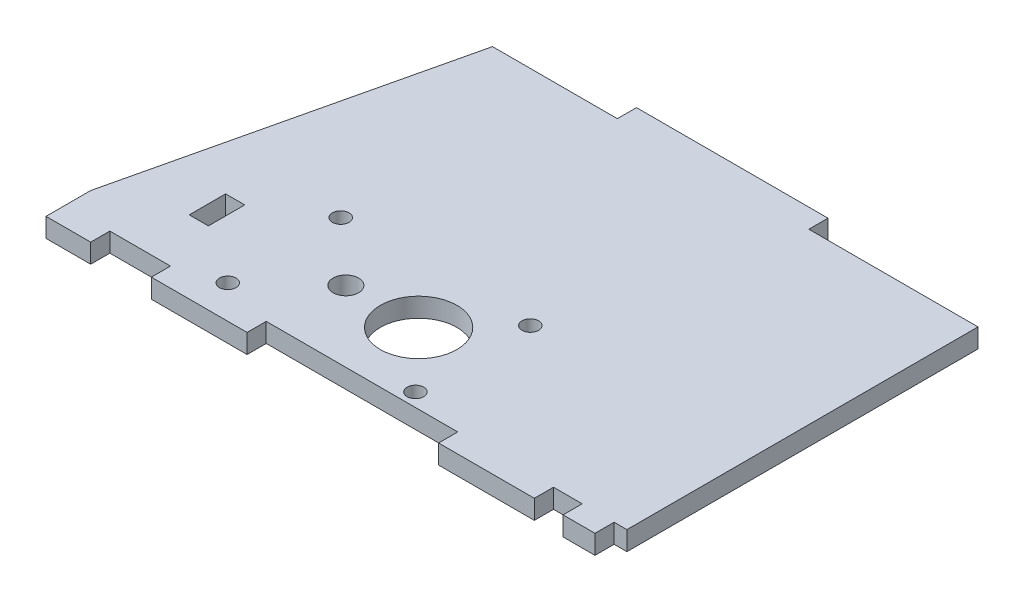
ISO-10303-21;
HEADER;
FILE_DESCRIPTION(('STEP AP214'),'2;1');
FILE_NAME('part.step','',(''),(''),'','','');
FILE_SCHEMA(('AUTOMOTIVE_DESIGN { 1 0 10303 214 1 1 1 1 }'));
ENDSEC;
DATA;
#1=APPLICATION_CONTEXT('core data for automotive mechanical design processes');
#2=APPLICATION_PROTOCOL_DEFINITION('international standard','automotive_design',2000,#1);
#3=PRODUCT_CONTEXT('',#1,'mechanical');
#4=PRODUCT('Part','Part','',(#3));
#5=PRODUCT_RELATED_PRODUCT_CATEGORY('part','',(#4));
#6=PRODUCT_DEFINITION_FORMATION('','',#4);
#7=PRODUCT_DEFINITION_CONTEXT('part definition',#1,'design');
#8=PRODUCT_DEFINITION('design','',#6,#7);
#9=PRODUCT_DEFINITION_SHAPE('','',#8);
#10=(LENGTH_UNIT() NAMED_UNIT(*) SI_UNIT(.MILLI.,.METRE.));
#11=(NAMED_UNIT(*) PLANE_ANGLE_UNIT() SI_UNIT($,.RADIAN.));
#12=(NAMED_UNIT(*) SI_UNIT($,.STERADIAN.) SOLID_ANGLE_UNIT());
#13=UNCERTAINTY_MEASURE_WITH_UNIT(LENGTH_MEASURE(1.E-05),#10,'distance_accuracy_value','');
#14=(GEOMETRIC_REPRESENTATION_CONTEXT(3) GLOBAL_UNCERTAINTY_ASSIGNED_CONTEXT((#13)) GLOBAL_UNIT_ASSIGNED_CONTEXT((#10,
#11,#12)) REPRESENTATION_CONTEXT('',''));
#15=CARTESIAN_POINT('',(0.,0.,0.));
#16=DIRECTION('',(0.,0.,1.));
#17=DIRECTION('',(1.,0.,0.));
#18=AXIS2_PLACEMENT_3D('',#15,#16,#17);
#19=CARTESIAN_POINT('',(0.,3.,0.));
#20=DIRECTION('',(0.,1.,0.));
#21=DIRECTION('',(0.,0.,1.));
#22=AXIS2_PLACEMENT_3D('',#19,#20,#21);
#23=PLANE('',#22);
#24=CARTESIAN_POINT('',(-59.4833722709216,3.,25.0323489280672));
#25=DIRECTION('',(0.,1.,0.));
#26=DIRECTION('',(0.,0.,1.));
#27=AXIS2_PLACEMENT_3D('',#24,#25,#26);
#28=CIRCLE('',#27,1.3);
#29=CARTESIAN_POINT('',(-59.4833722709216,3.,26.3323489280672));
#30=VERTEX_POINT('',#29);
#31=EDGE_CURVE('E275',#30,#30,#28,.T.);
#32=ORIENTED_EDGE('',*,*,#31,.F.);
#33=EDGE_LOOP('',(#32));
#34=FACE_BOUND('',#33,.T.);
#35=CARTESIAN_POINT('',(-67.9833722709216,3.,16.0323489280672));
#36=DIRECTION('',(0.,1.,0.));
#37=DIRECTION('',(0.,0.,1.));
#38=AXIS2_PLACEMENT_3D('',#35,#36,#37);
#39=CIRCLE('',#38,6.);
#40=CARTESIAN_POINT('',(-67.9833722709216,3.,22.0323489280672));
#41=VERTEX_POINT('',#40);
#42=EDGE_CURVE('E291',#41,#41,#39,.T.);
#43=ORIENTED_EDGE('',*,*,#42,.F.);
#44=EDGE_LOOP('',(#43));
#45=FACE_BOUND('',#44,.T.);
#46=CARTESIAN_POINT('',(-59.4833722709216,3.,7.03234892806724));
#47=DIRECTION('',(0.,1.,0.));
#48=DIRECTION('',(0.,0.,1.));
#49=AXIS2_PLACEMENT_3D('',#46,#47,#48);
#50=CIRCLE('',#49,1.3);
#51=CARTESIAN_POINT('',(-59.4833722709216,3.,8.33234892806724));
#52=VERTEX_POINT('',#51);
#53=EDGE_CURVE('E307',#52,#52,#50,.T.);
#54=ORIENTED_EDGE('',*,*,#53,.F.);
#55=EDGE_LOOP('',(#54));
#56=FACE_BOUND('',#55,.T.);
#57=DIRECTION('',(0.,0.,1.));
#58=VECTOR('',#57,1.);
#59=CARTESIAN_POINT('',(-95.7405819948676,3.,27.1466123534186));
#60=LINE('',#59,#58);
#61=CARTESIAN_POINT('',(-95.7405819948676,3.,27.1466123534186));
#62=VERTEX_POINT('',#61);
#63=CARTESIAN_POINT('',(-95.7405819948676,3.,30.1466123534186));
#64=VERTEX_POINT('',#63);
#65=EDGE_CURVE('E315',#62,#64,#60,.T.);
#66=ORIENTED_EDGE('',*,*,#65,.T.);
#67=DIRECTION('',(1.,0.,0.));
#68=VECTOR('',#67,1.);
#69=CARTESIAN_POINT('',(-95.7405819948676,3.,30.1466123534186));
#70=LINE('',#69,#68);
#71=CARTESIAN_POINT('',(-80.7405819948676,3.,30.1466123534186));
#72=VERTEX_POINT('',#71);
#73=EDGE_CURVE('E319',#64,#72,#70,.T.);
#74=ORIENTED_EDGE('',*,*,#73,.T.);
#75=DIRECTION('',(0.,0.,-1.));
#76=VECTOR('',#75,1.);
#77=CARTESIAN_POINT('',(-80.7405819948676,3.,30.1466123534186));
#78=LINE('',#77,#76);
#79=CARTESIAN_POINT('',(-80.7405819948676,3.,27.1466123534186));
#80=VERTEX_POINT('',#79);
#81=EDGE_CURVE('E323',#72,#80,#78,.T.);
#82=ORIENTED_EDGE('',*,*,#81,.T.);
#83=DIRECTION('',(1.,0.,0.));
#84=VECTOR('',#83,1.);
#85=CARTESIAN_POINT('',(-80.7405819948676,3.,27.1466123534186));
#86=LINE('',#85,#84);
#87=CARTESIAN_POINT('',(-50.7405819948676,3.,27.1466123534186));
#88=VERTEX_POINT('',#87);
#89=EDGE_CURVE('E326',#80,#88,#86,.T.);
#90=ORIENTED_EDGE('',*,*,#89,.T.);
#91=DIRECTION('',(0.,0.,1.));
#92=VECTOR('',#91,1.);
#93=CARTESIAN_POINT('',(-50.7405819948676,3.,30.1466123534186));
#94=LINE('',#93,#92);
#95=CARTESIAN_POINT('',(-50.7405819948676,3.,30.1466123534186));
#96=VERTEX_POINT('',#95);
#97=EDGE_CURVE('E329',#88,#96,#94,.T.);
#98=ORIENTED_EDGE('',*,*,#97,.T.);
#99=DIRECTION('',(1.,0.,0.));
#100=VECTOR('',#99,1.);
#101=CARTESIAN_POINT('',(-35.7405819948676,3.,30.1466123534186));
#102=LINE('',#101,#100);
#103=CARTESIAN_POINT('',(-35.7405819948676,3.,30.1466123534186));
#104=VERTEX_POINT('',#103);
#105=EDGE_CURVE('E332',#96,#104,#102,.T.);
#106=ORIENTED_EDGE('',*,*,#105,.T.);
#107=DIRECTION('',(0.,0.,-1.));
#108=VECTOR('',#107,1.);
#109=CARTESIAN_POINT('',(-35.7405819948676,3.,30.1466123534186));
#110=LINE('',#109,#108);
#111=CARTESIAN_POINT('',(-35.7405819948676,3.,27.1466123534186));
#112=VERTEX_POINT('',#111);
#113=EDGE_CURVE('E335',#104,#112,#110,.T.);
#114=ORIENTED_EDGE('',*,*,#113,.T.);
#115=DIRECTION('',(1.,0.,0.));
#116=VECTOR('',#115,1.);
#117=CARTESIAN_POINT('',(-35.7405819948676,3.,27.1466123534186));
#118=LINE('',#117,#116);
#119=CARTESIAN_POINT('',(-31.2405819948676,3.,27.1466123534186));
#120=VERTEX_POINT('',#119);
#121=EDGE_CURVE('E338',#112,#120,#118,.T.);
#122=ORIENTED_EDGE('',*,*,#121,.T.);
#123=DIRECTION('',(0.,0.,1.));
#124=VECTOR('',#123,1.);
#125=CARTESIAN_POINT('',(-31.2405819948676,3.,27.1466123534186));
#126=LINE('',#125,#124);
#127=CARTESIAN_POINT('',(-31.2405819948676,3.,30.1466123534186));
#128=VERTEX_POINT('',#127);
#129=EDGE_CURVE('E341',#120,#128,#126,.T.);
#130=ORIENTED_EDGE('',*,*,#129,.T.);
#131=DIRECTION('',(1.,0.,0.));
#132=VECTOR('',#131,1.);
#133=CARTESIAN_POINT('',(-31.2405819948676,3.,30.1466123534186));
#134=LINE('',#133,#132);
#135=CARTESIAN_POINT('',(-26.2405819948676,3.,30.1466123534186));
#136=VERTEX_POINT('',#135);
#137=EDGE_CURVE('E344',#128,#136,#134,.T.);
#138=ORIENTED_EDGE('',*,*,#137,.T.);
#139=DIRECTION('',(0.,0.,-1.));
#140=VECTOR('',#139,1.);
#141=CARTESIAN_POINT('',(-26.2405819948676,3.,30.1466123534186));
#142=LINE('',#141,#140);
#143=CARTESIAN_POINT('',(-26.2405819948676,3.,27.1466123534186));
#144=VERTEX_POINT('',#143);
#145=EDGE_CURVE('E347',#136,#144,#142,.T.);
#146=ORIENTED_EDGE('',*,*,#145,.T.);
#147=DIRECTION('',(1.,0.,0.));
#148=VECTOR('',#147,1.);
#149=CARTESIAN_POINT('',(-26.2405819948676,3.,27.1466123534186));
#150=LINE('',#149,#148);
#151=CARTESIAN_POINT('',(-24.2405819948676,3.,27.1466123534186));
#152=VERTEX_POINT('',#151);
#153=EDGE_CURVE('E350',#144,#152,#150,.T.);
#154=ORIENTED_EDGE('',*,*,#153,.T.);
#155=DIRECTION('',(0.,0.,-1.));
#156=VECTOR('',#155,1.);
#157=CARTESIAN_POINT('',(-24.2405819948676,3.,27.1466123534186));
#158=LINE('',#157,#156);
#159=CARTESIAN_POINT('',(-24.2405819948676,3.,-27.8533876465814));
#160=VERTEX_POINT('',#159);
#161=EDGE_CURVE('E353',#152,#160,#158,.T.);
#162=ORIENTED_EDGE('',*,*,#161,.T.);
#163=DIRECTION('',(-1.,0.,0.));
#164=VECTOR('',#163,1.);
#165=CARTESIAN_POINT('',(-24.2405819948676,3.,-27.8533876465814));
#166=LINE('',#165,#164);
#167=CARTESIAN_POINT('',(-50.7405819948676,3.,-27.8533876465814));
#168=VERTEX_POINT('',#167);
#169=EDGE_CURVE('E356',#160,#168,#166,.T.);
#170=ORIENTED_EDGE('',*,*,#169,.T.);
#171=DIRECTION('',(0.,0.,-1.));
#172=VECTOR('',#171,1.);
#173=CARTESIAN_POINT('',(-50.7405819948676,3.,-27.8533876465814));
#174=LINE('',#173,#172);
#175=CARTESIAN_POINT('',(-50.7405819948676,3.,-30.8533876465814));
#176=VERTEX_POINT('',#175);
#177=EDGE_CURVE('E359',#168,#176,#174,.T.);
#178=ORIENTED_EDGE('',*,*,#177,.T.);
#179=DIRECTION('',(-1.,0.,0.));
#180=VECTOR('',#179,1.);
#181=CARTESIAN_POINT('',(-80.7405819948676,3.,-30.8533876465814));
#182=LINE('',#181,#180);
#183=CARTESIAN_POINT('',(-80.7405819948676,3.,-30.8533876465814));
#184=VERTEX_POINT('',#183);
#185=EDGE_CURVE('E362',#176,#184,#182,.T.);
#186=ORIENTED_EDGE('',*,*,#185,.T.);
#187=DIRECTION('',(0.,0.,1.));
#188=VECTOR('',#187,1.);
#189=CARTESIAN_POINT('',(-80.7405819948676,3.,-27.8533876465814));
#190=LINE('',#189,#188);
#191=CARTESIAN_POINT('',(-80.7405819948676,3.,-27.8533876465814));
#192=VERTEX_POINT('',#191);
#193=EDGE_CURVE('E365',#184,#192,#190,.T.);
#194=ORIENTED_EDGE('',*,*,#193,.T.);
#195=DIRECTION('',(-1.,0.,0.));
#196=VECTOR('',#195,1.);
#197=CARTESIAN_POINT('',(-95.7405819948676,3.,-27.8533876465814));
#198=LINE('',#197,#196);
#199=CARTESIAN_POINT('',(-100.290581994868,3.,-27.8533876465814));
#200=VERTEX_POINT('',#199);
#201=EDGE_CURVE('E368',#192,#200,#198,.T.);
#202=ORIENTED_EDGE('',*,*,#201,.T.);
#203=DIRECTION('',(-0.228134770233683,0.,0.973629563340404));
#204=VECTOR('',#203,1.);
#205=CARTESIAN_POINT('',(-100.290581994868,3.,-27.8533876465814));
#206=LINE('',#205,#204);
#207=CARTESIAN_POINT('',(-112.240581994868,3.,23.1466123534186));
#208=VERTEX_POINT('',#207);
#209=EDGE_CURVE('E371',#200,#208,#206,.T.);
#210=ORIENTED_EDGE('',*,*,#209,.T.);
#211=DIRECTION('',(0.,0.,1.));
#212=VECTOR('',#211,1.);
#213=CARTESIAN_POINT('',(-112.240581994868,3.,27.1466123534186));
#214=LINE('',#213,#212);
#215=CARTESIAN_POINT('',(-112.240581994868,3.,30.1466123534186));
#216=VERTEX_POINT('',#215);
#217=EDGE_CURVE('E374',#208,#216,#214,.T.);
#218=ORIENTED_EDGE('',*,*,#217,.T.);
#219=DIRECTION('',(1.,0.,0.));
#220=VECTOR('',#219,1.);
#221=CARTESIAN_POINT('',(-112.240581994868,3.,30.1466123534186));
#222=LINE('',#221,#220);
#223=CARTESIAN_POINT('',(-105.240581994868,3.,30.1466123534186));
#224=VERTEX_POINT('',#223);
#225=EDGE_CURVE('E377',#216,#224,#222,.T.);
#226=ORIENTED_EDGE('',*,*,#225,.T.);
#227=DIRECTION('',(0.,0.,-1.));
#228=VECTOR('',#227,1.);
#229=CARTESIAN_POINT('',(-105.240581994868,3.,30.1466123534186));
#230=LINE('',#229,#228);
#231=CARTESIAN_POINT('',(-105.240581994868,3.,27.1466123534186));
#232=VERTEX_POINT('',#231);
#233=EDGE_CURVE('E380',#224,#232,#230,.T.);
#234=ORIENTED_EDGE('',*,*,#233,.T.);
#235=DIRECTION('',(1.,0.,0.));
#236=VECTOR('',#235,1.);
#237=CARTESIAN_POINT('',(-105.240581994868,3.,27.1466123534186));
#238=LINE('',#237,#236);
#239=EDGE_CURVE('E383',#232,#62,#238,.T.);
#240=ORIENTED_EDGE('',*,*,#239,.T.);
#241=EDGE_LOOP('',(#66,#74,#82,#90,#98,#106,#114,#122,#130,#138,#146,#154,#162,#170,#178,#186,
#194,#202,#210,#218,#226,#234,#240));
#242=FACE_BOUND('',#241,.T.);
#243=CARTESIAN_POINT('',(-79.3833722709216,3.,16.0323489280672));
#244=DIRECTION('',(0.,1.,0.));
#245=DIRECTION('',(0.,0.,1.));
#246=AXIS2_PLACEMENT_3D('',#243,#244,#245);
#247=CIRCLE('',#246,2.);
#248=CARTESIAN_POINT('',(-79.3833722709216,3.,18.0323489280672));
#249=VERTEX_POINT('',#248);
#250=EDGE_CURVE('E299',#249,#249,#247,.T.);
#251=ORIENTED_EDGE('',*,*,#250,.F.);
#252=EDGE_LOOP('',(#251));
#253=FACE_BOUND('',#252,.T.);
#254=CARTESIAN_POINT('',(-88.98337227,3.,7.23234893));
#255=DIRECTION('',(0.,1.,0.));
#256=DIRECTION('',(0.,0.,1.));
#257=AXIS2_PLACEMENT_3D('',#254,#255,#256);
#258=CIRCLE('',#257,1.29999999999999);
#259=CARTESIAN_POINT('',(-88.98337227,3.,8.53234892999999));
#260=VERTEX_POINT('',#259);
#261=EDGE_CURVE('E283',#260,#260,#258,.T.);
#262=ORIENTED_EDGE('',*,*,#261,.F.);
#263=EDGE_LOOP('',(#262));
#264=FACE_BOUND('',#263,.T.);
#265=CARTESIAN_POINT('',(-88.98337227,3.,24.93234893));
#266=DIRECTION('',(0.,1.,0.));
#267=DIRECTION('',(0.,0.,1.));
#268=AXIS2_PLACEMENT_3D('',#265,#266,#267);
#269=CIRCLE('',#268,1.3);
#270=CARTESIAN_POINT('',(-88.98337227,3.,26.23234893));
#271=VERTEX_POINT('',#270);
#272=EDGE_CURVE('E267',#271,#271,#269,.T.);
#273=ORIENTED_EDGE('',*,*,#272,.F.);
#274=EDGE_LOOP('',(#273));
#275=FACE_BOUND('',#274,.T.);
#276=DIRECTION('',(1.,0.,0.));
#277=VECTOR('',#276,1.);
#278=CARTESIAN_POINT('',(-98.2202350873633,3.,18.7291448471575));
#279=LINE('',#278,#277);
#280=CARTESIAN_POINT('',(-101.220235087363,3.,18.7291448471575));
#281=VERTEX_POINT('',#280);
#282=CARTESIAN_POINT('',(-98.2202350873633,3.,18.7291448471575));
#283=VERTEX_POINT('',#282);
#284=EDGE_CURVE('E228',#281,#283,#279,.T.);
#285=ORIENTED_EDGE('',*,*,#284,.F.);
#286=DIRECTION('',(0.,0.,1.));
#287=VECTOR('',#286,1.);
#288=CARTESIAN_POINT('',(-101.220235087363,3.,18.7291448471575));
#289=LINE('',#288,#287);
#290=CARTESIAN_POINT('',(-101.220235087363,3.,13.0323489280672));
#291=VERTEX_POINT('',#290);
#292=EDGE_CURVE('E219',#291,#281,#289,.T.);
#293=ORIENTED_EDGE('',*,*,#292,.F.);
#294=DIRECTION('',(-1.,0.,0.));
#295=VECTOR('',#294,1.);
#296=CARTESIAN_POINT('',(-101.220235087363,3.,13.0323489280672));
#297=LINE('',#296,#295);
#298=CARTESIAN_POINT('',(-98.2202350873633,3.,13.0323489280672));
#299=VERTEX_POINT('',#298);
#300=EDGE_CURVE('E245',#299,#291,#297,.T.);
#301=ORIENTED_EDGE('',*,*,#300,.F.);
#302=DIRECTION('',(0.,0.,-1.));
#303=VECTOR('',#302,1.);
#304=CARTESIAN_POINT('',(-98.2202350873633,3.,13.0323489280672));
#305=LINE('',#304,#303);
#306=EDGE_CURVE('E241',#283,#299,#305,.T.);
#307=ORIENTED_EDGE('',*,*,#306,.F.);
#308=EDGE_LOOP('',(#285,#293,#301,#307));
#309=FACE_BOUND('',#308,.T.);
#310=ADVANCED_FACE('F39',(#34,#45,#56,#242,#253,#264,#275,#309),#23,.T.);
#311=CARTESIAN_POINT('',(0.,0.,0.));
#312=DIRECTION('',(0.,1.,0.));
#313=DIRECTION('',(0.,0.,1.));
#314=AXIS2_PLACEMENT_3D('',#311,#312,#313);
#315=PLANE('',#314);
#316=CARTESIAN_POINT('',(-88.98337227,0.,24.93234893));
#317=DIRECTION('',(0.,1.,0.));
#318=DIRECTION('',(0.,0.,1.));
#319=AXIS2_PLACEMENT_3D('',#316,#317,#318);
#320=CIRCLE('',#319,1.3);
#321=CARTESIAN_POINT('',(-88.98337227,0.,26.23234893));
#322=VERTEX_POINT('',#321);
#323=EDGE_CURVE('E237',#322,#322,#320,.T.);
#324=ORIENTED_EDGE('',*,*,#323,.T.);
#325=EDGE_LOOP('',(#324));
#326=FACE_BOUND('',#325,.T.);
#327=CARTESIAN_POINT('',(-59.4833722709216,0.,25.0323489280672));
#328=DIRECTION('',(0.,1.,0.));
#329=DIRECTION('',(0.,0.,1.));
#330=AXIS2_PLACEMENT_3D('',#327,#328,#329);
#331=CIRCLE('',#330,1.3);
#332=CARTESIAN_POINT('',(-59.4833722709216,0.,26.3323489280672));
#333=VERTEX_POINT('',#332);
#334=EDGE_CURVE('E271',#333,#333,#331,.T.);
#335=ORIENTED_EDGE('',*,*,#334,.T.);
#336=EDGE_LOOP('',(#335));
#337=FACE_BOUND('',#336,.T.);
#338=CARTESIAN_POINT('',(-88.98337227,0.,7.23234893));
#339=DIRECTION('',(0.,1.,0.));
#340=DIRECTION('',(0.,0.,1.));
#341=AXIS2_PLACEMENT_3D('',#338,#339,#340);
#342=CIRCLE('',#341,1.29999999999999);
#343=CARTESIAN_POINT('',(-88.98337227,0.,8.53234892999999));
#344=VERTEX_POINT('',#343);
#345=EDGE_CURVE('E279',#344,#344,#342,.T.);
#346=ORIENTED_EDGE('',*,*,#345,.T.);
#347=EDGE_LOOP('',(#346));
#348=FACE_BOUND('',#347,.T.);
#349=CARTESIAN_POINT('',(-67.9833722709216,0.,16.0323489280672));
#350=DIRECTION('',(0.,1.,0.));
#351=DIRECTION('',(0.,0.,1.));
#352=AXIS2_PLACEMENT_3D('',#349,#350,#351);
#353=CIRCLE('',#352,6.);
#354=CARTESIAN_POINT('',(-67.9833722709216,0.,22.0323489280672));
#355=VERTEX_POINT('',#354);
#356=EDGE_CURVE('E287',#355,#355,#353,.T.);
#357=ORIENTED_EDGE('',*,*,#356,.T.);
#358=EDGE_LOOP('',(#357));
#359=FACE_BOUND('',#358,.T.);
#360=CARTESIAN_POINT('',(-79.3833722709216,0.,16.0323489280672));
#361=DIRECTION('',(0.,1.,0.));
#362=DIRECTION('',(0.,0.,1.));
#363=AXIS2_PLACEMENT_3D('',#360,#361,#362);
#364=CIRCLE('',#363,2.);
#365=CARTESIAN_POINT('',(-79.3833722709216,0.,18.0323489280672));
#366=VERTEX_POINT('',#365);
#367=EDGE_CURVE('E295',#366,#366,#364,.T.);
#368=ORIENTED_EDGE('',*,*,#367,.T.);
#369=EDGE_LOOP('',(#368));
#370=FACE_BOUND('',#369,.T.);
#371=CARTESIAN_POINT('',(-59.4833722709216,0.,7.03234892806724));
#372=DIRECTION('',(0.,1.,0.));
#373=DIRECTION('',(0.,0.,1.));
#374=AXIS2_PLACEMENT_3D('',#371,#372,#373);
#375=CIRCLE('',#374,1.3);
#376=CARTESIAN_POINT('',(-59.4833722709216,0.,8.33234892806724));
#377=VERTEX_POINT('',#376);
#378=EDGE_CURVE('E303',#377,#377,#375,.T.);
#379=ORIENTED_EDGE('',*,*,#378,.T.);
#380=EDGE_LOOP('',(#379));
#381=FACE_BOUND('',#380,.T.);
#382=DIRECTION('',(0.,0.,1.));
#383=VECTOR('',#382,1.);
#384=CARTESIAN_POINT('',(-95.7405819948676,0.,27.1466123534186));
#385=LINE('',#384,#383);
#386=CARTESIAN_POINT('',(-95.7405819948676,0.,27.1466123534186));
#387=VERTEX_POINT('',#386);
#388=CARTESIAN_POINT('',(-95.7405819948676,0.,30.1466123534186));
#389=VERTEX_POINT('',#388);
#390=EDGE_CURVE('E311',#387,#389,#385,.T.);
#391=ORIENTED_EDGE('',*,*,#390,.F.);
#392=DIRECTION('',(1.,0.,0.));
#393=VECTOR('',#392,1.);
#394=CARTESIAN_POINT('',(-105.240581994868,0.,27.1466123534186));
#395=LINE('',#394,#393);
#396=CARTESIAN_POINT('',(-105.240581994868,0.,27.1466123534186));
#397=VERTEX_POINT('',#396);
#398=EDGE_CURVE('E320',#397,#387,#395,.T.);
#399=ORIENTED_EDGE('',*,*,#398,.F.);
#400=DIRECTION('',(0.,0.,-1.));
#401=VECTOR('',#400,1.);
#402=CARTESIAN_POINT('',(-105.240581994868,0.,30.1466123534186));
#403=LINE('',#402,#401);
#404=CARTESIAN_POINT('',(-105.240581994868,0.,30.1466123534186));
#405=VERTEX_POINT('',#404);
#406=EDGE_CURVE('E453',#405,#397,#403,.T.);
#407=ORIENTED_EDGE('',*,*,#406,.F.);
#408=DIRECTION('',(1.,0.,0.));
#409=VECTOR('',#408,1.);
#410=CARTESIAN_POINT('',(-112.240581994868,0.,30.1466123534186));
#411=LINE('',#410,#409);
#412=CARTESIAN_POINT('',(-112.240581994868,0.,30.1466123534186));
#413=VERTEX_POINT('',#412);
#414=EDGE_CURVE('E450',#413,#405,#411,.T.);
#415=ORIENTED_EDGE('',*,*,#414,.F.);
#416=DIRECTION('',(0.,0.,1.));
#417=VECTOR('',#416,1.);
#418=CARTESIAN_POINT('',(-112.240581994868,0.,27.1466123534186));
#419=LINE('',#418,#417);
#420=CARTESIAN_POINT('',(-112.240581994868,0.,23.1466123534186));
#421=VERTEX_POINT('',#420);
#422=EDGE_CURVE('E447',#421,#413,#419,.T.);
#423=ORIENTED_EDGE('',*,*,#422,.F.);
#424=DIRECTION('',(-0.228134770233683,0.,0.973629563340404));
#425=VECTOR('',#424,1.);
#426=CARTESIAN_POINT('',(-100.290581994868,0.,-27.8533876465814));
#427=LINE('',#426,#425);
#428=CARTESIAN_POINT('',(-100.290581994868,0.,-27.8533876465814));
#429=VERTEX_POINT('',#428);
#430=EDGE_CURVE('E443',#429,#421,#427,.T.);
#431=ORIENTED_EDGE('',*,*,#430,.F.);
#432=DIRECTION('',(-1.,0.,0.));
#433=VECTOR('',#432,1.);
#434=CARTESIAN_POINT('',(-95.7405819948676,0.,-27.8533876465814));
#435=LINE('',#434,#433);
#436=CARTESIAN_POINT('',(-80.7405819948676,0.,-27.8533876465814));
#437=VERTEX_POINT('',#436);
#438=EDGE_CURVE('E440',#437,#429,#435,.T.);
#439=ORIENTED_EDGE('',*,*,#438,.F.);
#440=DIRECTION('',(0.,0.,1.));
#441=VECTOR('',#440,1.);
#442=CARTESIAN_POINT('',(-80.7405819948676,0.,-27.8533876465814));
#443=LINE('',#442,#441);
#444=CARTESIAN_POINT('',(-80.7405819948676,0.,-30.8533876465814));
#445=VERTEX_POINT('',#444);
#446=EDGE_CURVE('E436',#445,#437,#443,.T.);
#447=ORIENTED_EDGE('',*,*,#446,.F.);
#448=DIRECTION('',(-1.,0.,0.));
#449=VECTOR('',#448,1.);
#450=CARTESIAN_POINT('',(-80.7405819948676,0.,-30.8533876465814));
#451=LINE('',#450,#449);
#452=CARTESIAN_POINT('',(-50.7405819948676,0.,-30.8533876465814));
#453=VERTEX_POINT('',#452);
#454=EDGE_CURVE('E433',#453,#445,#451,.T.);
#455=ORIENTED_EDGE('',*,*,#454,.F.);
#456=DIRECTION('',(0.,0.,-1.));
#457=VECTOR('',#456,1.);
#458=CARTESIAN_POINT('',(-50.7405819948676,0.,-27.8533876465814));
#459=LINE('',#458,#457);
#460=CARTESIAN_POINT('',(-50.7405819948676,0.,-27.8533876465814));
#461=VERTEX_POINT('',#460);
#462=EDGE_CURVE('E430',#461,#453,#459,.T.);
#463=ORIENTED_EDGE('',*,*,#462,.F.);
#464=DIRECTION('',(-1.,0.,0.));
#465=VECTOR('',#464,1.);
#466=CARTESIAN_POINT('',(-35.7405819948676,0.,-27.8533876465814));
#467=LINE('',#466,#465);
#468=CARTESIAN_POINT('',(-24.2405819948676,0.,-27.8533876465814));
#469=VERTEX_POINT('',#468);
#470=EDGE_CURVE('E427',#469,#461,#467,.T.);
#471=ORIENTED_EDGE('',*,*,#470,.F.);
#472=DIRECTION('',(0.,0.,-1.));
#473=VECTOR('',#472,1.);
#474=CARTESIAN_POINT('',(-24.2405819948676,0.,27.1466123534186));
#475=LINE('',#474,#473);
#476=CARTESIAN_POINT('',(-24.2405819948676,0.,27.1466123534186));
#477=VERTEX_POINT('',#476);
#478=EDGE_CURVE('E423',#477,#469,#475,.T.);
#479=ORIENTED_EDGE('',*,*,#478,.F.);
#480=DIRECTION('',(1.,0.,0.));
#481=VECTOR('',#480,1.);
#482=CARTESIAN_POINT('',(-26.2405819948676,0.,27.1466123534186));
#483=LINE('',#482,#481);
#484=CARTESIAN_POINT('',(-26.2405819948676,0.,27.1466123534186));
#485=VERTEX_POINT('',#484);
#486=EDGE_CURVE('E420',#485,#477,#483,.T.);
#487=ORIENTED_EDGE('',*,*,#486,.F.);
#488=DIRECTION('',(0.,0.,-1.));
#489=VECTOR('',#488,1.);
#490=CARTESIAN_POINT('',(-26.2405819948676,0.,30.1466123534186));
#491=LINE('',#490,#489);
#492=CARTESIAN_POINT('',(-26.2405819948676,0.,30.1466123534186));
#493=VERTEX_POINT('',#492);
#494=EDGE_CURVE('E417',#493,#485,#491,.T.);
#495=ORIENTED_EDGE('',*,*,#494,.F.);
#496=DIRECTION('',(1.,0.,0.));
#497=VECTOR('',#496,1.);
#498=CARTESIAN_POINT('',(-31.2405819948676,0.,30.1466123534186));
#499=LINE('',#498,#497);
#500=CARTESIAN_POINT('',(-31.2405819948676,0.,30.1466123534186));
#501=VERTEX_POINT('',#500);
#502=EDGE_CURVE('E414',#501,#493,#499,.T.);
#503=ORIENTED_EDGE('',*,*,#502,.F.);
#504=DIRECTION('',(0.,0.,1.));
#505=VECTOR('',#504,1.);
#506=CARTESIAN_POINT('',(-31.2405819948676,0.,27.1466123534186));
#507=LINE('',#506,#505);
#508=CARTESIAN_POINT('',(-31.2405819948676,0.,27.1466123534186));
#509=VERTEX_POINT('',#508);
#510=EDGE_CURVE('E411',#509,#501,#507,.T.);
#511=ORIENTED_EDGE('',*,*,#510,.F.);
#512=DIRECTION('',(1.,0.,0.));
#513=VECTOR('',#512,1.);
#514=CARTESIAN_POINT('',(-35.7405819948676,0.,27.1466123534186));
#515=LINE('',#514,#513);
#516=CARTESIAN_POINT('',(-35.7405819948676,0.,27.1466123534186));
#517=VERTEX_POINT('',#516);
#518=EDGE_CURVE('E408',#517,#509,#515,.T.);
#519=ORIENTED_EDGE('',*,*,#518,.F.);
#520=DIRECTION('',(0.,0.,-1.));
#521=VECTOR('',#520,1.);
#522=CARTESIAN_POINT('',(-35.7405819948676,0.,30.1466123534186));
#523=LINE('',#522,#521);
#524=CARTESIAN_POINT('',(-35.7405819948676,0.,30.1466123534186));
#525=VERTEX_POINT('',#524);
#526=EDGE_CURVE('E405',#525,#517,#523,.T.);
#527=ORIENTED_EDGE('',*,*,#526,.F.);
#528=DIRECTION('',(1.,0.,0.));
#529=VECTOR('',#528,1.);
#530=CARTESIAN_POINT('',(-35.7405819948676,0.,30.1466123534186));
#531=LINE('',#530,#529);
#532=CARTESIAN_POINT('',(-50.7405819948676,0.,30.1466123534186));
#533=VERTEX_POINT('',#532);
#534=EDGE_CURVE('E402',#533,#525,#531,.T.);
#535=ORIENTED_EDGE('',*,*,#534,.F.);
#536=DIRECTION('',(0.,0.,1.));
#537=VECTOR('',#536,1.);
#538=CARTESIAN_POINT('',(-50.7405819948676,0.,30.1466123534186));
#539=LINE('',#538,#537);
#540=CARTESIAN_POINT('',(-50.7405819948676,0.,27.1466123534186));
#541=VERTEX_POINT('',#540);
#542=EDGE_CURVE('E399',#541,#533,#539,.T.);
#543=ORIENTED_EDGE('',*,*,#542,.F.);
#544=DIRECTION('',(1.,0.,0.));
#545=VECTOR('',#544,1.);
#546=CARTESIAN_POINT('',(-80.7405819948676,0.,27.1466123534186));
#547=LINE('',#546,#545);
#548=CARTESIAN_POINT('',(-80.7405819948676,0.,27.1466123534186));
#549=VERTEX_POINT('',#548);
#550=EDGE_CURVE('E396',#549,#541,#547,.T.);
#551=ORIENTED_EDGE('',*,*,#550,.F.);
#552=DIRECTION('',(0.,0.,-1.));
#553=VECTOR('',#552,1.);
#554=CARTESIAN_POINT('',(-80.7405819948676,0.,30.1466123534186));
#555=LINE('',#554,#553);
#556=CARTESIAN_POINT('',(-80.7405819948676,0.,30.1466123534186));
#557=VERTEX_POINT('',#556);
#558=EDGE_CURVE('E393',#557,#549,#555,.T.);
#559=ORIENTED_EDGE('',*,*,#558,.F.);
#560=DIRECTION('',(1.,0.,0.));
#561=VECTOR('',#560,1.);
#562=CARTESIAN_POINT('',(-95.7405819948676,0.,30.1466123534186));
#563=LINE('',#562,#561);
#564=EDGE_CURVE('E390',#389,#557,#563,.T.);
#565=ORIENTED_EDGE('',*,*,#564,.F.);
#566=EDGE_LOOP('',(#391,#399,#407,#415,#423,#431,#439,#447,#455,#463,#471,#479,#487,#495,#503,
#511,#519,#527,#535,#543,#551,#559,#565));
#567=FACE_BOUND('',#566,.T.);
#568=DIRECTION('',(0.,0.,1.));
#569=VECTOR('',#568,1.);
#570=CARTESIAN_POINT('',(-101.220235087363,0.,18.7291448471575));
#571=LINE('',#570,#569);
#572=CARTESIAN_POINT('',(-101.220235087363,0.,13.0323489280672));
#573=VERTEX_POINT('',#572);
#574=CARTESIAN_POINT('',(-101.220235087363,0.,18.7291448471575));
#575=VERTEX_POINT('',#574);
#576=EDGE_CURVE('E63',#573,#575,#571,.T.);
#577=ORIENTED_EDGE('',*,*,#576,.T.);
#578=DIRECTION('',(1.,0.,0.));
#579=VECTOR('',#578,1.);
#580=CARTESIAN_POINT('',(-98.2202350873633,0.,18.7291448471575));
#581=LINE('',#580,#579);
#582=CARTESIAN_POINT('',(-98.2202350873633,0.,18.7291448471575));
#583=VERTEX_POINT('',#582);
#584=EDGE_CURVE('E235',#575,#583,#581,.T.);
#585=ORIENTED_EDGE('',*,*,#584,.T.);
#586=DIRECTION('',(0.,0.,-1.));
#587=VECTOR('',#586,1.);
#588=CARTESIAN_POINT('',(-98.2202350873633,0.,13.0323489280672));
#589=LINE('',#588,#587);
#590=CARTESIAN_POINT('',(-98.2202350873633,0.,13.0323489280672));
#591=VERTEX_POINT('',#590);
#592=EDGE_CURVE('E254',#583,#591,#589,.T.);
#593=ORIENTED_EDGE('',*,*,#592,.T.);
#594=DIRECTION('',(-1.,0.,0.));
#595=VECTOR('',#594,1.);
#596=CARTESIAN_POINT('',(-101.220235087363,0.,13.0323489280672));
#597=LINE('',#596,#595);
#598=EDGE_CURVE('E229',#591,#573,#597,.T.);
#599=ORIENTED_EDGE('',*,*,#598,.T.);
#600=EDGE_LOOP('',(#577,#585,#593,#599));
#601=FACE_BOUND('',#600,.T.);
#602=ADVANCED_FACE('F552',(#326,#337,#348,#359,#370,#381,#567,#601),#315,.F.);
#603=CARTESIAN_POINT('',(-95.7405819948676,3.,27.1466123534186));
#604=DIRECTION('',(1.,0.,0.));
#605=DIRECTION('',(0.,0.,-1.));
#606=AXIS2_PLACEMENT_3D('',#603,#604,#605);
#607=PLANE('',#606);
#608=ORIENTED_EDGE('',*,*,#390,.T.);
#609=DIRECTION('',(0.,-1.,0.));
#610=VECTOR('',#609,1.);
#611=CARTESIAN_POINT('',(-95.7405819948676,3.,30.1466123534186));
#612=LINE('',#611,#610);
#613=EDGE_CURVE('E11',#64,#389,#612,.T.);
#614=ORIENTED_EDGE('',*,*,#613,.F.);
#615=ORIENTED_EDGE('',*,*,#65,.F.);
#616=DIRECTION('',(0.,-1.,0.));
#617=VECTOR('',#616,1.);
#618=CARTESIAN_POINT('',(-95.7405819948676,3.,27.1466123534186));
#619=LINE('',#618,#617);
#620=EDGE_CURVE('E386',#62,#387,#619,.T.);
#621=ORIENTED_EDGE('',*,*,#620,.T.);
#622=EDGE_LOOP('',(#608,#614,#615,#621));
#623=FACE_BOUND('',#622,.T.);
#624=ADVANCED_FACE('F41',(#623),#607,.F.);
#625=CARTESIAN_POINT('',(-95.7405819948676,3.,30.1466123534186));
#626=DIRECTION('',(0.,0.,-1.));
#627=DIRECTION('',(-1.,0.,0.));
#628=AXIS2_PLACEMENT_3D('',#625,#626,#627);
#629=PLANE('',#628);
#630=ORIENTED_EDGE('',*,*,#564,.T.);
#631=DIRECTION('',(0.,-1.,0.));
#632=VECTOR('',#631,1.);
#633=CARTESIAN_POINT('',(-80.7405819948676,3.,30.1466123534186));
#634=LINE('',#633,#632);
#635=EDGE_CURVE('E48',#72,#557,#634,.T.);
#636=ORIENTED_EDGE('',*,*,#635,.F.);
#637=ORIENTED_EDGE('',*,*,#73,.F.);
#638=ORIENTED_EDGE('',*,*,#613,.T.);
#639=EDGE_LOOP('',(#630,#636,#637,#638));
#640=FACE_BOUND('',#639,.T.);
#641=ADVANCED_FACE('F570',(#640),#629,.F.);
#642=CARTESIAN_POINT('',(-80.7405819948676,3.,30.1466123534186));
#643=DIRECTION('',(-1.,0.,0.));
#644=DIRECTION('',(0.,0.,1.));
#645=AXIS2_PLACEMENT_3D('',#642,#643,#644);
#646=PLANE('',#645);
#647=ORIENTED_EDGE('',*,*,#558,.T.);
#648=DIRECTION('',(0.,-1.,0.));
#649=VECTOR('',#648,1.);
#650=CARTESIAN_POINT('',(-80.7405819948676,3.,27.1466123534186));
#651=LINE('',#650,#649);
#652=EDGE_CURVE('E537',#80,#549,#651,.T.);
#653=ORIENTED_EDGE('',*,*,#652,.F.);
#654=ORIENTED_EDGE('',*,*,#81,.F.);
#655=ORIENTED_EDGE('',*,*,#635,.T.);
#656=EDGE_LOOP('',(#647,#653,#654,#655));
#657=FACE_BOUND('',#656,.T.);
#658=ADVANCED_FACE('F546',(#657),#646,.F.);
#659=CARTESIAN_POINT('',(-80.7405819948676,3.,27.1466123534186));
#660=DIRECTION('',(0.,0.,-1.));
#661=DIRECTION('',(-1.,0.,0.));
#662=AXIS2_PLACEMENT_3D('',#659,#660,#661);
#663=PLANE('',#662);
#664=ORIENTED_EDGE('',*,*,#550,.T.);
#665=DIRECTION('',(0.,-1.,0.));
#666=VECTOR('',#665,1.);
#667=CARTESIAN_POINT('',(-50.7405819948676,3.,27.1466123534186));
#668=LINE('',#667,#666);
#669=EDGE_CURVE('E533',#88,#541,#668,.T.);
#670=ORIENTED_EDGE('',*,*,#669,.F.);
#671=ORIENTED_EDGE('',*,*,#89,.F.);
#672=ORIENTED_EDGE('',*,*,#652,.T.);
#673=EDGE_LOOP('',(#664,#670,#671,#672));
#674=FACE_BOUND('',#673,.T.);
#675=ADVANCED_FACE('F558',(#674),#663,.F.);
#676=CARTESIAN_POINT('',(-50.7405819948676,3.,30.1466123534186));
#677=DIRECTION('',(1.,0.,0.));
#678=DIRECTION('',(0.,0.,-1.));
#679=AXIS2_PLACEMENT_3D('',#676,#677,#678);
#680=PLANE('',#679);
#681=ORIENTED_EDGE('',*,*,#542,.T.);
#682=DIRECTION('',(0.,-1.,0.));
#683=VECTOR('',#682,1.);
#684=CARTESIAN_POINT('',(-50.7405819948676,3.,30.1466123534186));
#685=LINE('',#684,#683);
#686=EDGE_CURVE('E529',#96,#533,#685,.T.);
#687=ORIENTED_EDGE('',*,*,#686,.F.);
#688=ORIENTED_EDGE('',*,*,#97,.F.);
#689=ORIENTED_EDGE('',*,*,#669,.T.);
#690=EDGE_LOOP('',(#681,#687,#688,#689));
#691=FACE_BOUND('',#690,.T.);
#692=ADVANCED_FACE('F562',(#691),#680,.F.);
#693=CARTESIAN_POINT('',(-35.7405819948676,3.,30.1466123534186));
#694=DIRECTION('',(0.,0.,-1.));
#695=DIRECTION('',(-1.,0.,0.));
#696=AXIS2_PLACEMENT_3D('',#693,#694,#695);
#697=PLANE('',#696);
#698=ORIENTED_EDGE('',*,*,#534,.T.);
#699=DIRECTION('',(0.,-1.,0.));
#700=VECTOR('',#699,1.);
#701=CARTESIAN_POINT('',(-35.7405819948676,3.,30.1466123534186));
#702=LINE('',#701,#700);
#703=EDGE_CURVE('E525',#104,#525,#702,.T.);
#704=ORIENTED_EDGE('',*,*,#703,.F.);
#705=ORIENTED_EDGE('',*,*,#105,.F.);
#706=ORIENTED_EDGE('',*,*,#686,.T.);
#707=EDGE_LOOP('',(#698,#704,#705,#706));
#708=FACE_BOUND('',#707,.T.);
#709=ADVANCED_FACE('F655',(#708),#697,.F.);
#710=CARTESIAN_POINT('',(-35.7405819948676,3.,30.1466123534186));
#711=DIRECTION('',(-1.,0.,0.));
#712=DIRECTION('',(0.,0.,1.));
#713=AXIS2_PLACEMENT_3D('',#710,#711,#712);
#714=PLANE('',#713);
#715=ORIENTED_EDGE('',*,*,#526,.T.);
#716=DIRECTION('',(0.,-1.,0.));
#717=VECTOR('',#716,1.);
#718=CARTESIAN_POINT('',(-35.7405819948676,3.,27.1466123534186));
#719=LINE('',#718,#717);
#720=EDGE_CURVE('E521',#112,#517,#719,.T.);
#721=ORIENTED_EDGE('',*,*,#720,.F.);
#722=ORIENTED_EDGE('',*,*,#113,.F.);
#723=ORIENTED_EDGE('',*,*,#703,.T.);
#724=EDGE_LOOP('',(#715,#721,#722,#723));
#725=FACE_BOUND('',#724,.T.);
#726=ADVANCED_FACE('F653',(#725),#714,.F.);
#727=CARTESIAN_POINT('',(-35.7405819948676,3.,27.1466123534186));
#728=DIRECTION('',(0.,0.,-1.));
#729=DIRECTION('',(-1.,0.,0.));
#730=AXIS2_PLACEMENT_3D('',#727,#728,#729);
#731=PLANE('',#730);
#732=ORIENTED_EDGE('',*,*,#518,.T.);
#733=DIRECTION('',(0.,-1.,0.));
#734=VECTOR('',#733,1.);
#735=CARTESIAN_POINT('',(-31.2405819948676,3.,27.1466123534186));
#736=LINE('',#735,#734);
#737=EDGE_CURVE('E517',#120,#509,#736,.T.);
#738=ORIENTED_EDGE('',*,*,#737,.F.);
#739=ORIENTED_EDGE('',*,*,#121,.F.);
#740=ORIENTED_EDGE('',*,*,#720,.T.);
#741=EDGE_LOOP('',(#732,#738,#739,#740));
#742=FACE_BOUND('',#741,.T.);
#743=ADVANCED_FACE('F649',(#742),#731,.F.);
#744=CARTESIAN_POINT('',(-31.2405819948676,3.,27.1466123534186));
#745=DIRECTION('',(1.,0.,0.));
#746=DIRECTION('',(0.,0.,-1.));
#747=AXIS2_PLACEMENT_3D('',#744,#745,#746);
#748=PLANE('',#747);
#749=ORIENTED_EDGE('',*,*,#510,.T.);
#750=DIRECTION('',(0.,-1.,0.));
#751=VECTOR('',#750,1.);
#752=CARTESIAN_POINT('',(-31.2405819948676,3.,30.1466123534186));
#753=LINE('',#752,#751);
#754=EDGE_CURVE('E513',#128,#501,#753,.T.);
#755=ORIENTED_EDGE('',*,*,#754,.F.);
#756=ORIENTED_EDGE('',*,*,#129,.F.);
#757=ORIENTED_EDGE('',*,*,#737,.T.);
#758=EDGE_LOOP('',(#749,#755,#756,#757));
#759=FACE_BOUND('',#758,.T.);
#760=ADVANCED_FACE('F644',(#759),#748,.F.);
#761=CARTESIAN_POINT('',(-31.2405819948676,3.,30.1466123534186));
#762=DIRECTION('',(0.,0.,-1.));
#763=DIRECTION('',(-1.,0.,0.));
#764=AXIS2_PLACEMENT_3D('',#761,#762,#763);
#765=PLANE('',#764);
#766=ORIENTED_EDGE('',*,*,#502,.T.);
#767=DIRECTION('',(0.,-1.,0.));
#768=VECTOR('',#767,1.);
#769=CARTESIAN_POINT('',(-26.2405819948676,3.,30.1466123534186));
#770=LINE('',#769,#768);
#771=EDGE_CURVE('E509',#136,#493,#770,.T.);
#772=ORIENTED_EDGE('',*,*,#771,.F.);
#773=ORIENTED_EDGE('',*,*,#137,.F.);
#774=ORIENTED_EDGE('',*,*,#754,.T.);
#775=EDGE_LOOP('',(#766,#772,#773,#774));
#776=FACE_BOUND('',#775,.T.);
#777=ADVANCED_FACE('F638',(#776),#765,.F.);
#778=CARTESIAN_POINT('',(-26.2405819948676,3.,30.1466123534186));
#779=DIRECTION('',(-1.,0.,0.));
#780=DIRECTION('',(0.,0.,1.));
#781=AXIS2_PLACEMENT_3D('',#778,#779,#780);
#782=PLANE('',#781);
#783=ORIENTED_EDGE('',*,*,#494,.T.);
#784=DIRECTION('',(0.,-1.,0.));
#785=VECTOR('',#784,1.);
#786=CARTESIAN_POINT('',(-26.2405819948676,3.,27.1466123534186));
#787=LINE('',#786,#785);
#788=EDGE_CURVE('E505',#144,#485,#787,.T.);
#789=ORIENTED_EDGE('',*,*,#788,.F.);
#790=ORIENTED_EDGE('',*,*,#145,.F.);
#791=ORIENTED_EDGE('',*,*,#771,.T.);
#792=EDGE_LOOP('',(#783,#789,#790,#791));
#793=FACE_BOUND('',#792,.T.);
#794=ADVANCED_FACE('F634',(#793),#782,.F.);
#795=CARTESIAN_POINT('',(-26.2405819948676,3.,27.1466123534186));
#796=DIRECTION('',(0.,0.,-1.));
#797=DIRECTION('',(-1.,0.,0.));
#798=AXIS2_PLACEMENT_3D('',#795,#796,#797);
#799=PLANE('',#798);
#800=ORIENTED_EDGE('',*,*,#486,.T.);
#801=DIRECTION('',(0.,-1.,0.));
#802=VECTOR('',#801,1.);
#803=CARTESIAN_POINT('',(-24.2405819948676,3.,27.1466123534186));
#804=LINE('',#803,#802);
#805=EDGE_CURVE('E501',#152,#477,#804,.T.);
#806=ORIENTED_EDGE('',*,*,#805,.F.);
#807=ORIENTED_EDGE('',*,*,#153,.F.);
#808=ORIENTED_EDGE('',*,*,#788,.T.);
#809=EDGE_LOOP('',(#800,#806,#807,#808));
#810=FACE_BOUND('',#809,.T.);
#811=ADVANCED_FACE('F629',(#810),#799,.F.);
#812=CARTESIAN_POINT('',(-24.2405819948676,3.,27.1466123534186));
#813=DIRECTION('',(-1.,0.,0.));
#814=DIRECTION('',(0.,0.,1.));
#815=AXIS2_PLACEMENT_3D('',#812,#813,#814);
#816=PLANE('',#815);
#817=ORIENTED_EDGE('',*,*,#478,.T.);
#818=DIRECTION('',(0.,-1.,0.));
#819=VECTOR('',#818,1.);
#820=CARTESIAN_POINT('',(-24.2405819948676,3.,-27.8533876465814));
#821=LINE('',#820,#819);
#822=EDGE_CURVE('E497',#160,#469,#821,.T.);
#823=ORIENTED_EDGE('',*,*,#822,.F.);
#824=ORIENTED_EDGE('',*,*,#161,.F.);
#825=ORIENTED_EDGE('',*,*,#805,.T.);
#826=EDGE_LOOP('',(#817,#823,#824,#825));
#827=FACE_BOUND('',#826,.T.);
#828=ADVANCED_FACE('F623',(#827),#816,.F.);
#829=CARTESIAN_POINT('',(-35.7405819948676,3.,-27.8533876465814));
#830=DIRECTION('',(0.,0.,1.));
#831=DIRECTION('',(1.,0.,0.));
#832=AXIS2_PLACEMENT_3D('',#829,#830,#831);
#833=PLANE('',#832);
#834=ORIENTED_EDGE('',*,*,#470,.T.);
#835=DIRECTION('',(0.,-1.,0.));
#836=VECTOR('',#835,1.);
#837=CARTESIAN_POINT('',(-50.7405819948676,3.,-27.8533876465814));
#838=LINE('',#837,#836);
#839=EDGE_CURVE('E493',#168,#461,#838,.T.);
#840=ORIENTED_EDGE('',*,*,#839,.F.);
#841=ORIENTED_EDGE('',*,*,#169,.F.);
#842=ORIENTED_EDGE('',*,*,#822,.T.);
#843=EDGE_LOOP('',(#834,#840,#841,#842));
#844=FACE_BOUND('',#843,.T.);
#845=ADVANCED_FACE('F619',(#844),#833,.F.);
#846=CARTESIAN_POINT('',(-50.7405819948676,3.,-27.8533876465814));
#847=DIRECTION('',(-1.,0.,0.));
#848=DIRECTION('',(0.,0.,1.));
#849=AXIS2_PLACEMENT_3D('',#846,#847,#848);
#850=PLANE('',#849);
#851=ORIENTED_EDGE('',*,*,#462,.T.);
#852=DIRECTION('',(0.,-1.,0.));
#853=VECTOR('',#852,1.);
#854=CARTESIAN_POINT('',(-50.7405819948676,3.,-30.8533876465814));
#855=LINE('',#854,#853);
#856=EDGE_CURVE('E489',#176,#453,#855,.T.);
#857=ORIENTED_EDGE('',*,*,#856,.F.);
#858=ORIENTED_EDGE('',*,*,#177,.F.);
#859=ORIENTED_EDGE('',*,*,#839,.T.);
#860=EDGE_LOOP('',(#851,#857,#858,#859));
#861=FACE_BOUND('',#860,.T.);
#862=ADVANCED_FACE('F614',(#861),#850,.F.);
#863=CARTESIAN_POINT('',(-80.7405819948676,3.,-30.8533876465814));
#864=DIRECTION('',(0.,0.,1.));
#865=DIRECTION('',(1.,0.,0.));
#866=AXIS2_PLACEMENT_3D('',#863,#864,#865);
#867=PLANE('',#866);
#868=ORIENTED_EDGE('',*,*,#454,.T.);
#869=DIRECTION('',(0.,-1.,0.));
#870=VECTOR('',#869,1.);
#871=CARTESIAN_POINT('',(-80.7405819948676,3.,-30.8533876465814));
#872=LINE('',#871,#870);
#873=EDGE_CURVE('E485',#184,#445,#872,.T.);
#874=ORIENTED_EDGE('',*,*,#873,.F.);
#875=ORIENTED_EDGE('',*,*,#185,.F.);
#876=ORIENTED_EDGE('',*,*,#856,.T.);
#877=EDGE_LOOP('',(#868,#874,#875,#876));
#878=FACE_BOUND('',#877,.T.);
#879=ADVANCED_FACE('F609',(#878),#867,.F.);
#880=CARTESIAN_POINT('',(-80.7405819948676,3.,-27.8533876465814));
#881=DIRECTION('',(1.,0.,0.));
#882=DIRECTION('',(0.,0.,-1.));
#883=AXIS2_PLACEMENT_3D('',#880,#881,#882);
#884=PLANE('',#883);
#885=ORIENTED_EDGE('',*,*,#446,.T.);
#886=DIRECTION('',(0.,-1.,0.));
#887=VECTOR('',#886,1.);
#888=CARTESIAN_POINT('',(-80.7405819948676,3.,-27.8533876465814));
#889=LINE('',#888,#887);
#890=EDGE_CURVE('E481',#192,#437,#889,.T.);
#891=ORIENTED_EDGE('',*,*,#890,.F.);
#892=ORIENTED_EDGE('',*,*,#193,.F.);
#893=ORIENTED_EDGE('',*,*,#873,.T.);
#894=EDGE_LOOP('',(#885,#891,#892,#893));
#895=FACE_BOUND('',#894,.T.);
#896=ADVANCED_FACE('F605',(#895),#884,.F.);
#897=CARTESIAN_POINT('',(-95.7405819948676,3.,-27.8533876465814));
#898=DIRECTION('',(0.,0.,1.));
#899=DIRECTION('',(1.,0.,0.));
#900=AXIS2_PLACEMENT_3D('',#897,#898,#899);
#901=PLANE('',#900);
#902=ORIENTED_EDGE('',*,*,#438,.T.);
#903=DIRECTION('',(0.,-1.,0.));
#904=VECTOR('',#903,1.);
#905=CARTESIAN_POINT('',(-100.290581994868,3.,-27.8533876465814));
#906=LINE('',#905,#904);
#907=EDGE_CURVE('E477',#200,#429,#906,.T.);
#908=ORIENTED_EDGE('',*,*,#907,.F.);
#909=ORIENTED_EDGE('',*,*,#201,.F.);
#910=ORIENTED_EDGE('',*,*,#890,.T.);
#911=EDGE_LOOP('',(#902,#908,#909,#910));
#912=FACE_BOUND('',#911,.T.);
#913=ADVANCED_FACE('F601',(#912),#901,.F.);
#914=CARTESIAN_POINT('',(-100.290581994868,3.,-27.8533876465814));
#915=DIRECTION('',(0.973629563340403,0.,0.228134770233683));
#916=DIRECTION('',(0.228134770233683,0.,-0.973629563340404));
#917=AXIS2_PLACEMENT_3D('',#914,#915,#916);
#918=PLANE('',#917);
#919=ORIENTED_EDGE('',*,*,#430,.T.);
#920=DIRECTION('',(0.,-1.,0.));
#921=VECTOR('',#920,1.);
#922=CARTESIAN_POINT('',(-112.240581994868,3.,23.1466123534186));
#923=LINE('',#922,#921);
#924=EDGE_CURVE('E473',#208,#421,#923,.T.);
#925=ORIENTED_EDGE('',*,*,#924,.F.);
#926=ORIENTED_EDGE('',*,*,#209,.F.);
#927=ORIENTED_EDGE('',*,*,#907,.T.);
#928=EDGE_LOOP('',(#919,#925,#926,#927));
#929=FACE_BOUND('',#928,.T.);
#930=ADVANCED_FACE('F592',(#929),#918,.F.);
#931=CARTESIAN_POINT('',(-112.240581994868,3.,27.1466123534186));
#932=DIRECTION('',(1.,0.,0.));
#933=DIRECTION('',(0.,0.,-1.));
#934=AXIS2_PLACEMENT_3D('',#931,#932,#933);
#935=PLANE('',#934);
#936=ORIENTED_EDGE('',*,*,#422,.T.);
#937=DIRECTION('',(0.,-1.,0.));
#938=VECTOR('',#937,1.);
#939=CARTESIAN_POINT('',(-112.240581994868,3.,30.1466123534186));
#940=LINE('',#939,#938);
#941=EDGE_CURVE('E469',#216,#413,#940,.T.);
#942=ORIENTED_EDGE('',*,*,#941,.F.);
#943=ORIENTED_EDGE('',*,*,#217,.F.);
#944=ORIENTED_EDGE('',*,*,#924,.T.);
#945=EDGE_LOOP('',(#936,#942,#943,#944));
#946=FACE_BOUND('',#945,.T.);
#947=ADVANCED_FACE('F596',(#946),#935,.F.);
#948=CARTESIAN_POINT('',(-112.240581994868,3.,30.1466123534186));
#949=DIRECTION('',(0.,0.,-1.));
#950=DIRECTION('',(-1.,0.,0.));
#951=AXIS2_PLACEMENT_3D('',#948,#949,#950);
#952=PLANE('',#951);
#953=ORIENTED_EDGE('',*,*,#414,.T.);
#954=DIRECTION('',(0.,-1.,0.));
#955=VECTOR('',#954,1.);
#956=CARTESIAN_POINT('',(-105.240581994868,3.,30.1466123534186));
#957=LINE('',#956,#955);
#958=EDGE_CURVE('E465',#224,#405,#957,.T.);
#959=ORIENTED_EDGE('',*,*,#958,.F.);
#960=ORIENTED_EDGE('',*,*,#225,.F.);
#961=ORIENTED_EDGE('',*,*,#941,.T.);
#962=EDGE_LOOP('',(#953,#959,#960,#961));
#963=FACE_BOUND('',#962,.T.);
#964=ADVANCED_FACE('F586',(#963),#952,.F.);
#965=CARTESIAN_POINT('',(-105.240581994868,3.,30.1466123534186));
#966=DIRECTION('',(-1.,0.,0.));
#967=DIRECTION('',(0.,0.,1.));
#968=AXIS2_PLACEMENT_3D('',#965,#966,#967);
#969=PLANE('',#968);
#970=ORIENTED_EDGE('',*,*,#406,.T.);
#971=DIRECTION('',(0.,-1.,0.));
#972=VECTOR('',#971,1.);
#973=CARTESIAN_POINT('',(-105.240581994868,3.,27.1466123534186));
#974=LINE('',#973,#972);
#975=EDGE_CURVE('E461',#232,#397,#974,.T.);
#976=ORIENTED_EDGE('',*,*,#975,.F.);
#977=ORIENTED_EDGE('',*,*,#233,.F.);
#978=ORIENTED_EDGE('',*,*,#958,.T.);
#979=EDGE_LOOP('',(#970,#976,#977,#978));
#980=FACE_BOUND('',#979,.T.);
#981=ADVANCED_FACE('F582',(#980),#969,.F.);
#982=CARTESIAN_POINT('',(-105.240581994868,3.,27.1466123534186));
#983=DIRECTION('',(0.,0.,-1.));
#984=DIRECTION('',(-1.,0.,0.));
#985=AXIS2_PLACEMENT_3D('',#982,#983,#984);
#986=PLANE('',#985);
#987=ORIENTED_EDGE('',*,*,#398,.T.);
#988=ORIENTED_EDGE('',*,*,#620,.F.);
#989=ORIENTED_EDGE('',*,*,#239,.F.);
#990=ORIENTED_EDGE('',*,*,#975,.T.);
#991=EDGE_LOOP('',(#987,#988,#989,#990));
#992=FACE_BOUND('',#991,.T.);
#993=ADVANCED_FACE('F577',(#992),#986,.F.);
#994=CARTESIAN_POINT('',(-59.4833722709216,3.,7.03234892806724));
#995=DIRECTION('',(0.,-1.,0.));
#996=DIRECTION('',(0.,0.,-1.));
#997=AXIS2_PLACEMENT_3D('',#994,#995,#996);
#998=CYLINDRICAL_SURFACE('',#997,1.3);
#999=ORIENTED_EDGE('',*,*,#53,.T.);
#1000=EDGE_LOOP('',(#999));
#1001=FACE_BOUND('',#1000,.T.);
#1002=ORIENTED_EDGE('',*,*,#378,.F.);
#1003=EDGE_LOOP('',(#1002));
#1004=FACE_BOUND('',#1003,.T.);
#1005=ADVANCED_FACE('F675',(#1001,#1004),#998,.F.);
#1006=CARTESIAN_POINT('',(-79.3833722709216,3.,16.0323489280672));
#1007=DIRECTION('',(0.,-1.,0.));
#1008=DIRECTION('',(0.,0.,-1.));
#1009=AXIS2_PLACEMENT_3D('',#1006,#1007,#1008);
#1010=CYLINDRICAL_SURFACE('',#1009,2.);
#1011=ORIENTED_EDGE('',*,*,#250,.T.);
#1012=EDGE_LOOP('',(#1011));
#1013=FACE_BOUND('',#1012,.T.);
#1014=ORIENTED_EDGE('',*,*,#367,.F.);
#1015=EDGE_LOOP('',(#1014));
#1016=FACE_BOUND('',#1015,.T.);
#1017=ADVANCED_FACE('F779',(#1013,#1016),#1010,.F.);
#1018=CARTESIAN_POINT('',(-67.9833722709216,3.,16.0323489280672));
#1019=DIRECTION('',(0.,-1.,0.));
#1020=DIRECTION('',(0.,0.,-1.));
#1021=AXIS2_PLACEMENT_3D('',#1018,#1019,#1020);
#1022=CYLINDRICAL_SURFACE('',#1021,6.);
#1023=ORIENTED_EDGE('',*,*,#42,.T.);
#1024=EDGE_LOOP('',(#1023));
#1025=FACE_BOUND('',#1024,.T.);
#1026=ORIENTED_EDGE('',*,*,#356,.F.);
#1027=EDGE_LOOP('',(#1026));
#1028=FACE_BOUND('',#1027,.T.);
#1029=ADVANCED_FACE('F786',(#1025,#1028),#1022,.F.);
#1030=CARTESIAN_POINT('',(-88.98337227,3.,7.23234893));
#1031=DIRECTION('',(0.,-1.,0.));
#1032=DIRECTION('',(0.,0.,-1.));
#1033=AXIS2_PLACEMENT_3D('',#1030,#1031,#1032);
#1034=CYLINDRICAL_SURFACE('',#1033,1.29999999999999);
#1035=ORIENTED_EDGE('',*,*,#261,.T.);
#1036=EDGE_LOOP('',(#1035));
#1037=FACE_BOUND('',#1036,.T.);
#1038=ORIENTED_EDGE('',*,*,#345,.F.);
#1039=EDGE_LOOP('',(#1038));
#1040=FACE_BOUND('',#1039,.T.);
#1041=ADVANCED_FACE('F793',(#1037,#1040),#1034,.F.);
#1042=CARTESIAN_POINT('',(-59.4833722709216,3.,25.0323489280672));
#1043=DIRECTION('',(0.,-1.,0.));
#1044=DIRECTION('',(0.,0.,-1.));
#1045=AXIS2_PLACEMENT_3D('',#1042,#1043,#1044);
#1046=CYLINDRICAL_SURFACE('',#1045,1.3);
#1047=ORIENTED_EDGE('',*,*,#31,.T.);
#1048=EDGE_LOOP('',(#1047));
#1049=FACE_BOUND('',#1048,.T.);
#1050=ORIENTED_EDGE('',*,*,#334,.F.);
#1051=EDGE_LOOP('',(#1050));
#1052=FACE_BOUND('',#1051,.T.);
#1053=ADVANCED_FACE('F801',(#1049,#1052),#1046,.F.);
#1054=CARTESIAN_POINT('',(-88.98337227,3.,24.93234893));
#1055=DIRECTION('',(0.,-1.,0.));
#1056=DIRECTION('',(0.,0.,-1.));
#1057=AXIS2_PLACEMENT_3D('',#1054,#1055,#1056);
#1058=CYLINDRICAL_SURFACE('',#1057,1.3);
#1059=ORIENTED_EDGE('',*,*,#272,.T.);
#1060=EDGE_LOOP('',(#1059));
#1061=FACE_BOUND('',#1060,.T.);
#1062=ORIENTED_EDGE('',*,*,#323,.F.);
#1063=EDGE_LOOP('',(#1062));
#1064=FACE_BOUND('',#1063,.T.);
#1065=ADVANCED_FACE('F809',(#1061,#1064),#1058,.F.);
#1066=CARTESIAN_POINT('',(-101.220235087363,3.,18.7291448471575));
#1067=DIRECTION('',(1.,0.,0.));
#1068=DIRECTION('',(0.,0.,-1.));
#1069=AXIS2_PLACEMENT_3D('',#1066,#1067,#1068);
#1070=PLANE('',#1069);
#1071=ORIENTED_EDGE('',*,*,#576,.F.);
#1072=DIRECTION('',(0.,-1.,0.));
#1073=VECTOR('',#1072,1.);
#1074=CARTESIAN_POINT('',(-101.220235087363,3.,13.0323489280672));
#1075=LINE('',#1074,#1073);
#1076=EDGE_CURVE('E223',#291,#573,#1075,.T.);
#1077=ORIENTED_EDGE('',*,*,#1076,.F.);
#1078=ORIENTED_EDGE('',*,*,#292,.T.);
#1079=DIRECTION('',(0.,-1.,0.));
#1080=VECTOR('',#1079,1.);
#1081=CARTESIAN_POINT('',(-101.220235087363,3.,18.7291448471575));
#1082=LINE('',#1081,#1080);
#1083=EDGE_CURVE('E222',#281,#575,#1082,.T.);
#1084=ORIENTED_EDGE('',*,*,#1083,.T.);
#1085=EDGE_LOOP('',(#1071,#1077,#1078,#1084));
#1086=FACE_BOUND('',#1085,.T.);
#1087=ADVANCED_FACE('F221',(#1086),#1070,.T.);
#1088=CARTESIAN_POINT('',(-98.2202350873633,3.,18.7291448471575));
#1089=DIRECTION('',(0.,0.,-1.));
#1090=DIRECTION('',(-1.,0.,0.));
#1091=AXIS2_PLACEMENT_3D('',#1088,#1089,#1090);
#1092=PLANE('',#1091);
#1093=ORIENTED_EDGE('',*,*,#584,.F.);
#1094=ORIENTED_EDGE('',*,*,#1083,.F.);
#1095=ORIENTED_EDGE('',*,*,#284,.T.);
#1096=DIRECTION('',(0.,-1.,0.));
#1097=VECTOR('',#1096,1.);
#1098=CARTESIAN_POINT('',(-98.2202350873633,3.,18.7291448471575));
#1099=LINE('',#1098,#1097);
#1100=EDGE_CURVE('E238',#283,#583,#1099,.T.);
#1101=ORIENTED_EDGE('',*,*,#1100,.T.);
#1102=EDGE_LOOP('',(#1093,#1094,#1095,#1101));
#1103=FACE_BOUND('',#1102,.T.);
#1104=ADVANCED_FACE('F232',(#1103),#1092,.T.);
#1105=CARTESIAN_POINT('',(-98.2202350873633,3.,13.0323489280672));
#1106=DIRECTION('',(-1.,0.,0.));
#1107=DIRECTION('',(0.,0.,1.));
#1108=AXIS2_PLACEMENT_3D('',#1105,#1106,#1107);
#1109=PLANE('',#1108);
#1110=ORIENTED_EDGE('',*,*,#592,.F.);
#1111=ORIENTED_EDGE('',*,*,#1100,.F.);
#1112=ORIENTED_EDGE('',*,*,#306,.T.);
#1113=DIRECTION('',(0.,-1.,0.));
#1114=VECTOR('',#1113,1.);
#1115=CARTESIAN_POINT('',(-98.2202350873633,3.,13.0323489280672));
#1116=LINE('',#1115,#1114);
#1117=EDGE_CURVE('E55',#299,#591,#1116,.T.);
#1118=ORIENTED_EDGE('',*,*,#1117,.T.);
#1119=EDGE_LOOP('',(#1110,#1111,#1112,#1118));
#1120=FACE_BOUND('',#1119,.T.);
#1121=ADVANCED_FACE('F830',(#1120),#1109,.T.);
#1122=CARTESIAN_POINT('',(-101.220235087363,3.,13.0323489280672));
#1123=DIRECTION('',(0.,0.,1.));
#1124=DIRECTION('',(1.,0.,0.));
#1125=AXIS2_PLACEMENT_3D('',#1122,#1123,#1124);
#1126=PLANE('',#1125);
#1127=ORIENTED_EDGE('',*,*,#598,.F.);
#1128=ORIENTED_EDGE('',*,*,#1117,.F.);
#1129=ORIENTED_EDGE('',*,*,#300,.T.);
#1130=ORIENTED_EDGE('',*,*,#1076,.T.);
#1131=EDGE_LOOP('',(#1127,#1128,#1129,#1130));
#1132=FACE_BOUND('',#1131,.T.);
#1133=ADVANCED_FACE('F837',(#1132),#1126,.T.);
#1134=CLOSED_SHELL('',(#310,#602,#624,#641,#658,#675,#692,#709,#726,#743,#760,#777,#794,#811,
#828,#845,#862,#879,#896,#913,#930,#947,#964,#981,#993,#1005,#1017,#1029,#1041,#1053,#1065,
#1087,#1104,#1121,#1133));
#1135=MANIFOLD_SOLID_BREP('B2',#1134);
#1136=ADVANCED_BREP_SHAPE_REPRESENTATION('',(#18,#1135),#14);
#1137=SHAPE_DEFINITION_REPRESENTATION(#9,#1136);
ENDSEC;
END-ISO-10303-21;
